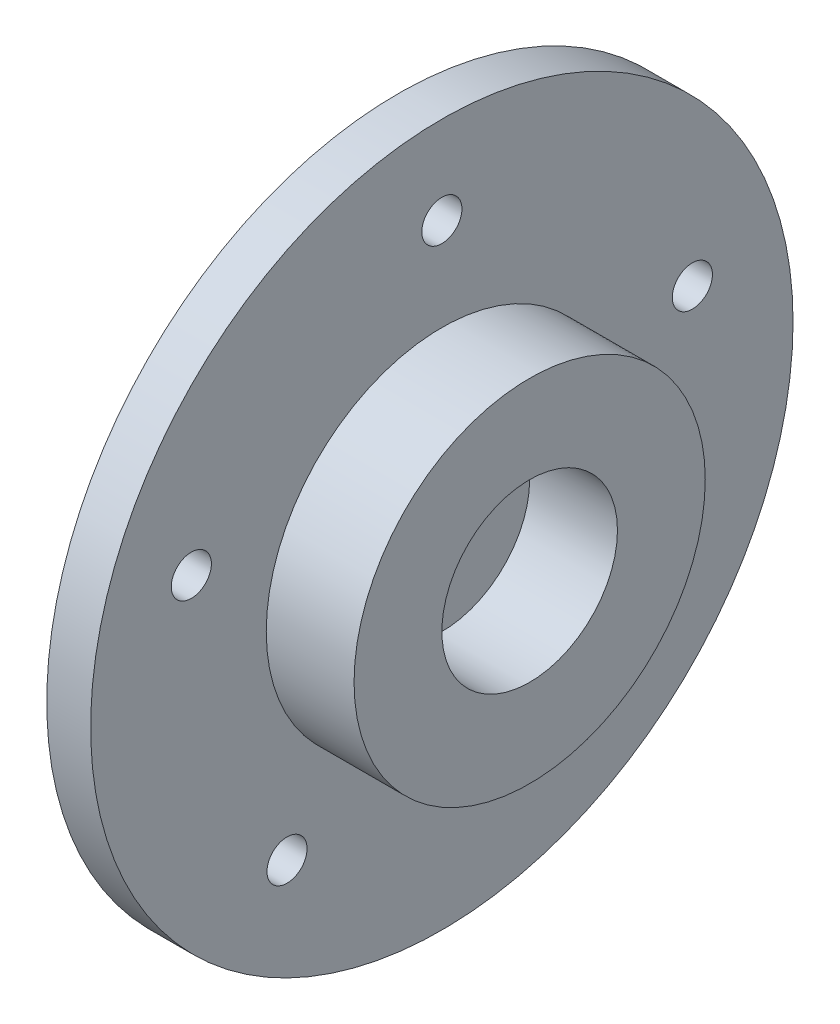
ISO-10303-21;
HEADER;
FILE_DESCRIPTION(('STEP AP214'),'2;1');
FILE_NAME('part.step','',(''),(''),'','','');
FILE_SCHEMA(('AUTOMOTIVE_DESIGN { 1 0 10303 214 1 1 1 1 }'));
ENDSEC;
DATA;
#1=APPLICATION_CONTEXT('core data for automotive mechanical design processes');
#2=APPLICATION_PROTOCOL_DEFINITION('international standard','automotive_design',2000,#1);
#3=PRODUCT_CONTEXT('',#1,'mechanical');
#4=PRODUCT('Part','Part','',(#3));
#5=PRODUCT_RELATED_PRODUCT_CATEGORY('part','',(#4));
#6=PRODUCT_DEFINITION_FORMATION('','',#4);
#7=PRODUCT_DEFINITION_CONTEXT('part definition',#1,'design');
#8=PRODUCT_DEFINITION('design','',#6,#7);
#9=PRODUCT_DEFINITION_SHAPE('','',#8);
#10=(LENGTH_UNIT() NAMED_UNIT(*) SI_UNIT(.MILLI.,.METRE.));
#11=(NAMED_UNIT(*) PLANE_ANGLE_UNIT() SI_UNIT($,.RADIAN.));
#12=(NAMED_UNIT(*) SI_UNIT($,.STERADIAN.) SOLID_ANGLE_UNIT());
#13=UNCERTAINTY_MEASURE_WITH_UNIT(LENGTH_MEASURE(1.E-05),#10,'distance_accuracy_value','');
#14=(GEOMETRIC_REPRESENTATION_CONTEXT(3) GLOBAL_UNCERTAINTY_ASSIGNED_CONTEXT((#13)) GLOBAL_UNIT_ASSIGNED_CONTEXT((#10,
#11,#12)) REPRESENTATION_CONTEXT('',''));
#15=CARTESIAN_POINT('',(0.,0.,0.));
#16=DIRECTION('',(0.,0.,1.));
#17=DIRECTION('',(1.,0.,0.));
#18=AXIS2_PLACEMENT_3D('',#15,#16,#17);
#19=CARTESIAN_POINT('',(6.35,0.711302035018839,0.));
#20=DIRECTION('',(1.,0.,0.));
#21=DIRECTION('',(0.,0.,-1.));
#22=AXIS2_PLACEMENT_3D('',#19,#20,#21);
#23=PLANE('',#22);
#24=CARTESIAN_POINT('',(6.35,0.,0.));
#25=DIRECTION('',(1.,0.,0.));
#26=DIRECTION('',(0.,0.,-1.));
#27=AXIS2_PLACEMENT_3D('',#24,#25,#26);
#28=CIRCLE('',#27,25.4);
#29=CARTESIAN_POINT('',(6.35,0.,-25.4));
#30=VERTEX_POINT('',#29);
#31=EDGE_CURVE('E10',#30,#30,#28,.T.);
#32=ORIENTED_EDGE('',*,*,#31,.F.);
#33=EDGE_LOOP('',(#32));
#34=FACE_BOUND('',#33,.T.);
#35=CARTESIAN_POINT('',(6.35,12.4848495207045,-36.2352532708453));
#36=DIRECTION('',(1.,0.,0.));
#37=DIRECTION('',(0.,0.,-1.));
#38=AXIS2_PLACEMENT_3D('',#35,#36,#37);
#39=CIRCLE('',#38,2.9);
#40=CARTESIAN_POINT('',(6.35,12.4848495207045,-39.1352532708453));
#41=VERTEX_POINT('',#40);
#42=EDGE_CURVE('E65',#41,#41,#39,.T.);
#43=ORIENTED_EDGE('',*,*,#42,.F.);
#44=EDGE_LOOP('',(#43));
#45=FACE_BOUND('',#44,.T.);
#46=CARTESIAN_POINT('',(6.35,-30.1122454506667,22.3946181123432));
#47=DIRECTION('',(1.,0.,0.));
#48=DIRECTION('',(0.,0.,-1.));
#49=AXIS2_PLACEMENT_3D('',#46,#47,#48);
#50=CIRCLE('',#49,2.9);
#51=CARTESIAN_POINT('',(6.35,-30.1122454506667,19.4946181123432));
#52=VERTEX_POINT('',#51);
#53=EDGE_CURVE('E81',#52,#52,#50,.T.);
#54=ORIENTED_EDGE('',*,*,#53,.F.);
#55=EDGE_LOOP('',(#54));
#56=FACE_BOUND('',#55,.T.);
#57=CARTESIAN_POINT('',(6.35,0.711302035018839,0.));
#58=DIRECTION('',(1.,0.,0.));
#59=DIRECTION('',(0.,0.,-1.));
#60=AXIS2_PLACEMENT_3D('',#57,#58,#59);
#61=CIRCLE('',#60,50.8);
#62=CARTESIAN_POINT('',(6.35,0.711302035018839,-50.8));
#63=VERTEX_POINT('',#62);
#64=EDGE_CURVE('E46',#63,#63,#61,.T.);
#65=ORIENTED_EDGE('',*,*,#64,.T.);
#66=EDGE_LOOP('',(#65));
#67=FACE_BOUND('',#66,.T.);
#68=CARTESIAN_POINT('',(6.35,12.4848495207042,36.2352532708454));
#69=DIRECTION('',(1.,0.,0.));
#70=DIRECTION('',(0.,0.,-1.));
#71=AXIS2_PLACEMENT_3D('',#68,#69,#70);
#72=CIRCLE('',#71,2.9);
#73=CARTESIAN_POINT('',(6.35,12.4848495207042,33.3352532708454));
#74=VERTEX_POINT('',#73);
#75=EDGE_CURVE('E89',#74,#74,#72,.T.);
#76=ORIENTED_EDGE('',*,*,#75,.F.);
#77=EDGE_LOOP('',(#76));
#78=FACE_BOUND('',#77,.T.);
#79=CARTESIAN_POINT('',(6.35,-30.1122454506666,-22.3946181123433));
#80=DIRECTION('',(1.,0.,0.));
#81=DIRECTION('',(0.,0.,-1.));
#82=AXIS2_PLACEMENT_3D('',#79,#80,#81);
#83=CIRCLE('',#82,2.9);
#84=CARTESIAN_POINT('',(6.35,-30.1122454506666,-25.2946181123433));
#85=VERTEX_POINT('',#84);
#86=EDGE_CURVE('E73',#85,#85,#83,.T.);
#87=ORIENTED_EDGE('',*,*,#86,.F.);
#88=EDGE_LOOP('',(#87));
#89=FACE_BOUND('',#88,.T.);
#90=CARTESIAN_POINT('',(6.35,38.8113020350188,0.));
#91=DIRECTION('',(1.,0.,0.));
#92=DIRECTION('',(0.,0.,-1.));
#93=AXIS2_PLACEMENT_3D('',#90,#91,#92);
#94=CIRCLE('',#93,2.9);
#95=CARTESIAN_POINT('',(6.35,38.8113020350188,-2.9));
#96=VERTEX_POINT('',#95);
#97=EDGE_CURVE('E56',#96,#96,#94,.T.);
#98=ORIENTED_EDGE('',*,*,#97,.F.);
#99=EDGE_LOOP('',(#98));
#100=FACE_BOUND('',#99,.T.);
#101=ADVANCED_FACE('F37',(#34,#45,#56,#67,#78,#89,#100),#23,.T.);
#102=CARTESIAN_POINT('',(0.,0.711302035018839,0.));
#103=DIRECTION('',(1.,0.,0.));
#104=DIRECTION('',(0.,0.,-1.));
#105=AXIS2_PLACEMENT_3D('',#102,#103,#104);
#106=PLANE('',#105);
#107=CARTESIAN_POINT('',(0.,0.711302035018839,0.));
#108=DIRECTION('',(1.,0.,0.));
#109=DIRECTION('',(0.,0.,-1.));
#110=AXIS2_PLACEMENT_3D('',#107,#108,#109);
#111=CIRCLE('',#110,50.8);
#112=CARTESIAN_POINT('',(0.,0.711302035018839,-50.8));
#113=VERTEX_POINT('',#112);
#114=EDGE_CURVE('E41',#113,#113,#111,.T.);
#115=ORIENTED_EDGE('',*,*,#114,.F.);
#116=EDGE_LOOP('',(#115));
#117=FACE_BOUND('',#116,.T.);
#118=CARTESIAN_POINT('',(0.,12.4848495207042,36.2352532708454));
#119=DIRECTION('',(1.,0.,0.));
#120=DIRECTION('',(0.,0.,-1.));
#121=AXIS2_PLACEMENT_3D('',#118,#119,#120);
#122=CIRCLE('',#121,2.9);
#123=CARTESIAN_POINT('',(0.,12.4848495207042,33.3352532708454));
#124=VERTEX_POINT('',#123);
#125=EDGE_CURVE('E85',#124,#124,#122,.T.);
#126=ORIENTED_EDGE('',*,*,#125,.T.);
#127=EDGE_LOOP('',(#126));
#128=FACE_BOUND('',#127,.T.);
#129=CARTESIAN_POINT('',(0.,-30.1122454506667,22.3946181123432));
#130=DIRECTION('',(1.,0.,0.));
#131=DIRECTION('',(0.,0.,-1.));
#132=AXIS2_PLACEMENT_3D('',#129,#130,#131);
#133=CIRCLE('',#132,2.9);
#134=CARTESIAN_POINT('',(0.,-30.1122454506667,19.4946181123432));
#135=VERTEX_POINT('',#134);
#136=EDGE_CURVE('E77',#135,#135,#133,.T.);
#137=ORIENTED_EDGE('',*,*,#136,.T.);
#138=EDGE_LOOP('',(#137));
#139=FACE_BOUND('',#138,.T.);
#140=CARTESIAN_POINT('',(0.,-30.1122454506666,-22.3946181123433));
#141=DIRECTION('',(1.,0.,0.));
#142=DIRECTION('',(0.,0.,-1.));
#143=AXIS2_PLACEMENT_3D('',#140,#141,#142);
#144=CIRCLE('',#143,2.9);
#145=CARTESIAN_POINT('',(0.,-30.1122454506666,-25.2946181123433));
#146=VERTEX_POINT('',#145);
#147=EDGE_CURVE('E69',#146,#146,#144,.T.);
#148=ORIENTED_EDGE('',*,*,#147,.T.);
#149=EDGE_LOOP('',(#148));
#150=FACE_BOUND('',#149,.T.);
#151=CARTESIAN_POINT('',(0.,12.4848495207045,-36.2352532708453));
#152=DIRECTION('',(1.,0.,0.));
#153=DIRECTION('',(0.,0.,-1.));
#154=AXIS2_PLACEMENT_3D('',#151,#152,#153);
#155=CIRCLE('',#154,2.9);
#156=CARTESIAN_POINT('',(0.,12.4848495207045,-39.1352532708453));
#157=VERTEX_POINT('',#156);
#158=EDGE_CURVE('E60',#157,#157,#155,.T.);
#159=ORIENTED_EDGE('',*,*,#158,.T.);
#160=EDGE_LOOP('',(#159));
#161=FACE_BOUND('',#160,.T.);
#162=CARTESIAN_POINT('',(0.,38.8113020350188,0.));
#163=DIRECTION('',(1.,0.,0.));
#164=DIRECTION('',(0.,0.,-1.));
#165=AXIS2_PLACEMENT_3D('',#162,#163,#164);
#166=CIRCLE('',#165,2.9);
#167=CARTESIAN_POINT('',(0.,38.8113020350188,-2.9));
#168=VERTEX_POINT('',#167);
#169=EDGE_CURVE('E61',#168,#168,#166,.T.);
#170=ORIENTED_EDGE('',*,*,#169,.T.);
#171=EDGE_LOOP('',(#170));
#172=FACE_BOUND('',#171,.T.);
#173=ADVANCED_FACE('F97',(#117,#128,#139,#150,#161,#172),#106,.F.);
#174=CARTESIAN_POINT('',(6.35,0.711302035018839,0.));
#175=DIRECTION('',(-1.,0.,0.));
#176=DIRECTION('',(0.,0.,1.));
#177=AXIS2_PLACEMENT_3D('',#174,#175,#176);
#178=CYLINDRICAL_SURFACE('',#177,50.8);
#179=ORIENTED_EDGE('',*,*,#64,.F.);
#180=EDGE_LOOP('',(#179));
#181=FACE_BOUND('',#180,.T.);
#182=ORIENTED_EDGE('',*,*,#114,.T.);
#183=EDGE_LOOP('',(#182));
#184=FACE_BOUND('',#183,.T.);
#185=ADVANCED_FACE('F39',(#181,#184),#178,.T.);
#186=CARTESIAN_POINT('',(6.35,12.4848495207042,36.2352532708454));
#187=DIRECTION('',(-1.,0.,0.));
#188=DIRECTION('',(0.,0.,1.));
#189=AXIS2_PLACEMENT_3D('',#186,#187,#188);
#190=CYLINDRICAL_SURFACE('',#189,2.9);
#191=ORIENTED_EDGE('',*,*,#75,.T.);
#192=EDGE_LOOP('',(#191));
#193=FACE_BOUND('',#192,.T.);
#194=ORIENTED_EDGE('',*,*,#125,.F.);
#195=EDGE_LOOP('',(#194));
#196=FACE_BOUND('',#195,.T.);
#197=ADVANCED_FACE('F100',(#193,#196),#190,.F.);
#198=CARTESIAN_POINT('',(6.35,-30.1122454506667,22.3946181123432));
#199=DIRECTION('',(-1.,0.,0.));
#200=DIRECTION('',(0.,0.,1.));
#201=AXIS2_PLACEMENT_3D('',#198,#199,#200);
#202=CYLINDRICAL_SURFACE('',#201,2.9);
#203=ORIENTED_EDGE('',*,*,#53,.T.);
#204=EDGE_LOOP('',(#203));
#205=FACE_BOUND('',#204,.T.);
#206=ORIENTED_EDGE('',*,*,#136,.F.);
#207=EDGE_LOOP('',(#206));
#208=FACE_BOUND('',#207,.T.);
#209=ADVANCED_FACE('F102',(#205,#208),#202,.F.);
#210=CARTESIAN_POINT('',(6.35,-30.1122454506666,-22.3946181123433));
#211=DIRECTION('',(-1.,0.,0.));
#212=DIRECTION('',(0.,0.,1.));
#213=AXIS2_PLACEMENT_3D('',#210,#211,#212);
#214=CYLINDRICAL_SURFACE('',#213,2.9);
#215=ORIENTED_EDGE('',*,*,#86,.T.);
#216=EDGE_LOOP('',(#215));
#217=FACE_BOUND('',#216,.T.);
#218=ORIENTED_EDGE('',*,*,#147,.F.);
#219=EDGE_LOOP('',(#218));
#220=FACE_BOUND('',#219,.T.);
#221=ADVANCED_FACE('F109',(#217,#220),#214,.F.);
#222=CARTESIAN_POINT('',(6.35,12.4848495207045,-36.2352532708453));
#223=DIRECTION('',(-1.,0.,0.));
#224=DIRECTION('',(0.,0.,1.));
#225=AXIS2_PLACEMENT_3D('',#222,#223,#224);
#226=CYLINDRICAL_SURFACE('',#225,2.9);
#227=ORIENTED_EDGE('',*,*,#42,.T.);
#228=EDGE_LOOP('',(#227));
#229=FACE_BOUND('',#228,.T.);
#230=ORIENTED_EDGE('',*,*,#158,.F.);
#231=EDGE_LOOP('',(#230));
#232=FACE_BOUND('',#231,.T.);
#233=ADVANCED_FACE('F137',(#229,#232),#226,.F.);
#234=CARTESIAN_POINT('',(6.35,38.8113020350188,0.));
#235=DIRECTION('',(-1.,0.,0.));
#236=DIRECTION('',(0.,0.,1.));
#237=AXIS2_PLACEMENT_3D('',#234,#235,#236);
#238=CYLINDRICAL_SURFACE('',#237,2.9);
#239=ORIENTED_EDGE('',*,*,#97,.T.);
#240=EDGE_LOOP('',(#239));
#241=FACE_BOUND('',#240,.T.);
#242=ORIENTED_EDGE('',*,*,#169,.F.);
#243=EDGE_LOOP('',(#242));
#244=FACE_BOUND('',#243,.T.);
#245=ADVANCED_FACE('F133',(#241,#244),#238,.F.);
#246=CARTESIAN_POINT('',(19.05,0.,0.));
#247=DIRECTION('',(-1.,0.,0.));
#248=DIRECTION('',(0.,0.,1.));
#249=AXIS2_PLACEMENT_3D('',#246,#247,#248);
#250=CYLINDRICAL_SURFACE('',#249,25.4);
#251=CARTESIAN_POINT('',(19.05,0.,0.));
#252=DIRECTION('',(1.,0.,0.));
#253=DIRECTION('',(0.,0.,-1.));
#254=AXIS2_PLACEMENT_3D('',#251,#252,#253);
#255=CIRCLE('',#254,25.4);
#256=CARTESIAN_POINT('',(19.05,0.,-25.4));
#257=VERTEX_POINT('',#256);
#258=EDGE_CURVE('E54',#257,#257,#255,.T.);
#259=ORIENTED_EDGE('',*,*,#258,.F.);
#260=EDGE_LOOP('',(#259));
#261=FACE_BOUND('',#260,.T.);
#262=ORIENTED_EDGE('',*,*,#31,.T.);
#263=EDGE_LOOP('',(#262));
#264=FACE_BOUND('',#263,.T.);
#265=ADVANCED_FACE('F136',(#261,#264),#250,.T.);
#266=CARTESIAN_POINT('',(19.05,0.,0.));
#267=DIRECTION('',(1.,0.,0.));
#268=DIRECTION('',(0.,0.,-1.));
#269=AXIS2_PLACEMENT_3D('',#266,#267,#268);
#270=PLANE('',#269);
#271=CARTESIAN_POINT('',(19.05,0.,0.));
#272=DIRECTION('',(1.,0.,0.));
#273=DIRECTION('',(0.,0.,-1.));
#274=AXIS2_PLACEMENT_3D('',#271,#272,#273);
#275=CIRCLE('',#274,12.7);
#276=CARTESIAN_POINT('',(19.05,0.,-12.7));
#277=VERTEX_POINT('',#276);
#278=EDGE_CURVE('E219',#277,#277,#275,.T.);
#279=ORIENTED_EDGE('',*,*,#278,.F.);
#280=EDGE_LOOP('',(#279));
#281=FACE_BOUND('',#280,.T.);
#282=ORIENTED_EDGE('',*,*,#258,.T.);
#283=EDGE_LOOP('',(#282));
#284=FACE_BOUND('',#283,.T.);
#285=ADVANCED_FACE('F145',(#281,#284),#270,.T.);
#286=CARTESIAN_POINT('',(6.35,0.,0.));
#287=DIRECTION('',(1.,0.,0.));
#288=DIRECTION('',(0.,0.,-1.));
#289=AXIS2_PLACEMENT_3D('',#286,#287,#288);
#290=CYLINDRICAL_SURFACE('',#289,12.7);
#291=CARTESIAN_POINT('',(6.35,0.,0.));
#292=DIRECTION('',(1.,0.,0.));
#293=DIRECTION('',(0.,0.,-1.));
#294=AXIS2_PLACEMENT_3D('',#291,#292,#293);
#295=CIRCLE('',#294,12.7);
#296=CARTESIAN_POINT('',(6.35,0.,-12.7));
#297=VERTEX_POINT('',#296);
#298=EDGE_CURVE('E217',#297,#297,#295,.T.);
#299=ORIENTED_EDGE('',*,*,#298,.F.);
#300=EDGE_LOOP('',(#299));
#301=FACE_BOUND('',#300,.T.);
#302=ORIENTED_EDGE('',*,*,#278,.T.);
#303=EDGE_LOOP('',(#302));
#304=FACE_BOUND('',#303,.T.);
#305=ADVANCED_FACE('F192',(#301,#304),#290,.F.);
#306=CARTESIAN_POINT('',(6.35,0.,0.));
#307=DIRECTION('',(1.,0.,0.));
#308=DIRECTION('',(0.,0.,-1.));
#309=AXIS2_PLACEMENT_3D('',#306,#307,#308);
#310=PLANE('',#309);
#311=ORIENTED_EDGE('',*,*,#298,.T.);
#312=EDGE_LOOP('',(#311));
#313=FACE_BOUND('',#312,.T.);
#314=ADVANCED_FACE('F201',(#313),#310,.T.);
#315=CLOSED_SHELL('',(#101,#173,#185,#197,#209,#221,#233,#245,#265,#285,#305,#314));
#316=MANIFOLD_SOLID_BREP('B2',#315);
#317=ADVANCED_BREP_SHAPE_REPRESENTATION('',(#18,#316),#14);
#318=SHAPE_DEFINITION_REPRESENTATION(#9,#317);
ENDSEC;
END-ISO-10303-21;
